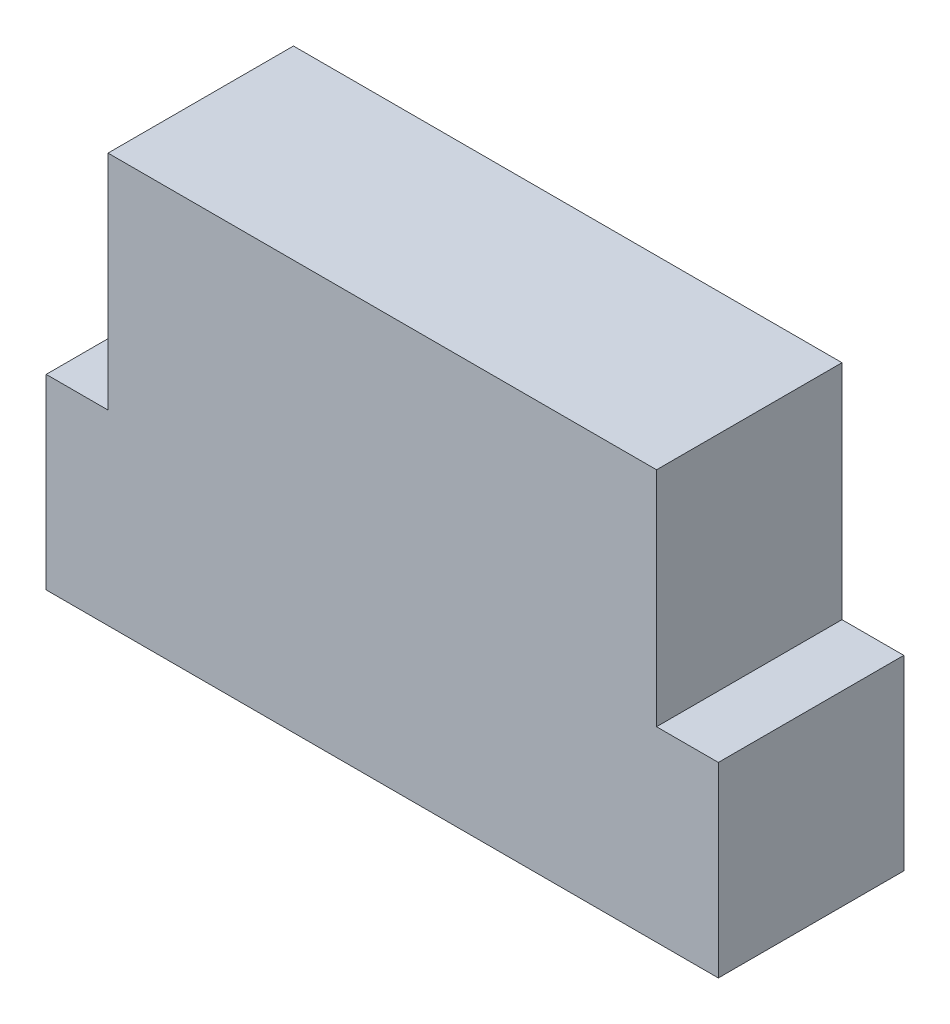
ISO-10303-21;
HEADER;
FILE_DESCRIPTION(('STEP AP214'),'2;1');
FILE_NAME('part.step','',(''),(''),'','','');
FILE_SCHEMA(('AUTOMOTIVE_DESIGN { 1 0 10303 214 1 1 1 1 }'));
ENDSEC;
DATA;
#1=APPLICATION_CONTEXT('core data for automotive mechanical design processes');
#2=APPLICATION_PROTOCOL_DEFINITION('international standard','automotive_design',2000,#1);
#3=PRODUCT_CONTEXT('',#1,'mechanical');
#4=PRODUCT('Part','Part','',(#3));
#5=PRODUCT_RELATED_PRODUCT_CATEGORY('part','',(#4));
#6=PRODUCT_DEFINITION_FORMATION('','',#4);
#7=PRODUCT_DEFINITION_CONTEXT('part definition',#1,'design');
#8=PRODUCT_DEFINITION('design','',#6,#7);
#9=PRODUCT_DEFINITION_SHAPE('','',#8);
#10=(LENGTH_UNIT() NAMED_UNIT(*) SI_UNIT(.MILLI.,.METRE.));
#11=(NAMED_UNIT(*) PLANE_ANGLE_UNIT() SI_UNIT($,.RADIAN.));
#12=(NAMED_UNIT(*) SI_UNIT($,.STERADIAN.) SOLID_ANGLE_UNIT());
#13=UNCERTAINTY_MEASURE_WITH_UNIT(LENGTH_MEASURE(1.E-05),#10,'distance_accuracy_value','');
#14=(GEOMETRIC_REPRESENTATION_CONTEXT(3) GLOBAL_UNCERTAINTY_ASSIGNED_CONTEXT((#13)) GLOBAL_UNIT_ASSIGNED_CONTEXT((#10,
#11,#12)) REPRESENTATION_CONTEXT('',''));
#15=CARTESIAN_POINT('',(0.,0.,0.));
#16=DIRECTION('',(0.,0.,1.));
#17=DIRECTION('',(1.,0.,0.));
#18=AXIS2_PLACEMENT_3D('',#15,#16,#17);
#19=CARTESIAN_POINT('',(26.0732989064762,1.79274179869862,6.06575945623128));
#20=DIRECTION('',(-1.,0.,0.));
#21=DIRECTION('',(0.,-1.,0.));
#22=AXIS2_PLACEMENT_3D('',#19,#20,#21);
#23=PLANE('',#22);
#24=DIRECTION('',(0.,0.,-1.));
#25=VECTOR('',#24,1.);
#26=CARTESIAN_POINT('',(26.0732989064762,0.292741798698615,7.46575945623128));
#27=LINE('',#26,#25);
#28=CARTESIAN_POINT('',(26.0732989064762,0.292741798698618,7.56575945623128));
#29=VERTEX_POINT('',#28);
#30=CARTESIAN_POINT('',(26.0732989064762,0.292741798698618,6.06575945623128));
#31=VERTEX_POINT('',#30);
#32=EDGE_CURVE('E324',#29,#31,#27,.T.);
#33=ORIENTED_EDGE('',*,*,#32,.T.);
#34=DIRECTION('',(0.,-1.,0.));
#35=VECTOR('',#34,1.);
#36=CARTESIAN_POINT('',(26.0732989064762,1.79274179869862,6.06575945623128));
#37=LINE('',#36,#35);
#38=CARTESIAN_POINT('',(26.0732989064762,2.09274179869862,6.06575945623128));
#39=VERTEX_POINT('',#38);
#40=EDGE_CURVE('E310',#39,#31,#37,.T.);
#41=ORIENTED_EDGE('',*,*,#40,.F.);
#42=DIRECTION('',(0.,0.,-1.));
#43=VECTOR('',#42,1.);
#44=CARTESIAN_POINT('',(26.0732989064762,2.09274179869862,7.46575945623128));
#45=LINE('',#44,#43);
#46=CARTESIAN_POINT('',(26.0732989064762,2.09274179869862,7.56575945623128));
#47=VERTEX_POINT('',#46);
#48=EDGE_CURVE('E285',#47,#39,#45,.T.);
#49=ORIENTED_EDGE('',*,*,#48,.F.);
#50=DIRECTION('',(0.,1.,0.));
#51=VECTOR('',#50,1.);
#52=CARTESIAN_POINT('',(26.0732989064762,0.292741798698618,7.56575945623128));
#53=LINE('',#52,#51);
#54=EDGE_CURVE('E230',#29,#47,#53,.T.);
#55=ORIENTED_EDGE('',*,*,#54,.F.);
#56=EDGE_LOOP('',(#33,#41,#49,#55));
#57=FACE_BOUND('',#56,.T.);
#58=ADVANCED_FACE('F42',(#57),#23,.F.);
#59=CARTESIAN_POINT('',(21.4694999999998,2.09274179869861,6.06575945623128));
#60=DIRECTION('',(0.,-1.,0.));
#61=DIRECTION('',(1.,0.,0.));
#62=AXIS2_PLACEMENT_3D('',#59,#60,#61);
#63=PLANE('',#62);
#64=DIRECTION('',(0.,0.,1.));
#65=VECTOR('',#64,1.);
#66=CARTESIAN_POINT('',(21.6367010935235,2.09274179869862,7.46575945623128));
#67=LINE('',#66,#65);
#68=CARTESIAN_POINT('',(21.6367010935235,2.09274179869862,6.06575945623128));
#69=VERTEX_POINT('',#68);
#70=CARTESIAN_POINT('',(21.6367010935235,2.09274179869862,7.56575945623128));
#71=VERTEX_POINT('',#70);
#72=EDGE_CURVE('E282',#69,#71,#67,.T.);
#73=ORIENTED_EDGE('',*,*,#72,.T.);
#74=DIRECTION('',(-1.,0.,0.));
#75=VECTOR('',#74,1.);
#76=CARTESIAN_POINT('',(26.0732989064762,2.09274179869862,7.56575945623128));
#77=LINE('',#76,#75);
#78=EDGE_CURVE('E234',#47,#71,#77,.T.);
#79=ORIENTED_EDGE('',*,*,#78,.F.);
#80=ORIENTED_EDGE('',*,*,#48,.T.);
#81=DIRECTION('',(-1.,0.,0.));
#82=VECTOR('',#81,1.);
#83=CARTESIAN_POINT('',(21.6367010935235,2.09274179869862,6.06575945623128));
#84=LINE('',#83,#82);
#85=EDGE_CURVE('E289',#39,#69,#84,.T.);
#86=ORIENTED_EDGE('',*,*,#85,.T.);
#87=EDGE_LOOP('',(#73,#79,#80,#86));
#88=FACE_BOUND('',#87,.T.);
#89=ADVANCED_FACE('F381',(#88),#63,.F.);
#90=CARTESIAN_POINT('',(21.6367010935235,1.79274179869862,7.46575945623128));
#91=DIRECTION('',(1.,0.,0.));
#92=DIRECTION('',(0.,1.,0.));
#93=AXIS2_PLACEMENT_3D('',#90,#91,#92);
#94=PLANE('',#93);
#95=DIRECTION('',(0.,0.,-1.));
#96=VECTOR('',#95,1.);
#97=CARTESIAN_POINT('',(21.6367010935235,0.292741798698615,7.46575945623128));
#98=LINE('',#97,#96);
#99=CARTESIAN_POINT('',(21.6367010935235,0.292741798698615,7.56575945623128));
#100=VERTEX_POINT('',#99);
#101=CARTESIAN_POINT('',(21.6367010935235,0.292741798698615,6.06575945623128));
#102=VERTEX_POINT('',#101);
#103=EDGE_CURVE('E332',#100,#102,#98,.T.);
#104=ORIENTED_EDGE('',*,*,#103,.F.);
#105=DIRECTION('',(0.,-1.,0.));
#106=VECTOR('',#105,1.);
#107=CARTESIAN_POINT('',(21.6367010935235,2.09274179869862,7.56575945623128));
#108=LINE('',#107,#106);
#109=EDGE_CURVE('E178',#71,#100,#108,.T.);
#110=ORIENTED_EDGE('',*,*,#109,.F.);
#111=ORIENTED_EDGE('',*,*,#72,.F.);
#112=DIRECTION('',(0.,-1.,0.));
#113=VECTOR('',#112,1.);
#114=CARTESIAN_POINT('',(21.6367010935235,1.79274179869862,6.06575945623128));
#115=LINE('',#114,#113);
#116=EDGE_CURVE('E307',#69,#102,#115,.T.);
#117=ORIENTED_EDGE('',*,*,#116,.T.);
#118=EDGE_LOOP('',(#104,#110,#111,#117));
#119=FACE_BOUND('',#118,.T.);
#120=ADVANCED_FACE('F384',(#119),#94,.F.);
#121=CARTESIAN_POINT('',(21.4694999999998,0.582342587762689,7.56575945623128));
#122=DIRECTION('',(0.,0.,1.));
#123=DIRECTION('',(1.,0.,0.));
#124=AXIS2_PLACEMENT_3D('',#121,#122,#123);
#125=PLANE('',#124);
#126=DIRECTION('',(0.,1.,0.));
#127=VECTOR('',#126,1.);
#128=CARTESIAN_POINT('',(21.1367010935235,0.292741798698615,7.56575945623128));
#129=LINE('',#128,#127);
#130=CARTESIAN_POINT('',(21.1367010935235,-1.21725820130139,7.56575945623128));
#131=VERTEX_POINT('',#130);
#132=CARTESIAN_POINT('',(21.1367010935235,0.292741798698615,7.56575945623128));
#133=VERTEX_POINT('',#132);
#134=EDGE_CURVE('E173',#131,#133,#129,.T.);
#135=ORIENTED_EDGE('',*,*,#134,.F.);
#136=DIRECTION('',(1.,0.,0.));
#137=VECTOR('',#136,1.);
#138=CARTESIAN_POINT('',(22.5084999999998,-1.21725820130138,7.56575945623128));
#139=LINE('',#138,#137);
#140=CARTESIAN_POINT('',(26.5732989064762,-1.21725820130138,7.56575945623128));
#141=VERTEX_POINT('',#140);
#142=EDGE_CURVE('E166',#131,#141,#139,.T.);
#143=ORIENTED_EDGE('',*,*,#142,.T.);
#144=DIRECTION('',(0.,-1.,0.));
#145=VECTOR('',#144,1.);
#146=CARTESIAN_POINT('',(26.5732989064762,0.292741798698619,7.56575945623128));
#147=LINE('',#146,#145);
#148=CARTESIAN_POINT('',(26.5732989064762,0.292741798698619,7.56575945623128));
#149=VERTEX_POINT('',#148);
#150=EDGE_CURVE('E171',#149,#141,#147,.T.);
#151=ORIENTED_EDGE('',*,*,#150,.F.);
#152=DIRECTION('',(-1.,0.,0.));
#153=VECTOR('',#152,1.);
#154=CARTESIAN_POINT('',(26.5732989064762,0.292741798698619,7.56575945623128));
#155=LINE('',#154,#153);
#156=EDGE_CURVE('E198',#149,#29,#155,.T.);
#157=ORIENTED_EDGE('',*,*,#156,.T.);
#158=ORIENTED_EDGE('',*,*,#54,.T.);
#159=ORIENTED_EDGE('',*,*,#78,.T.);
#160=ORIENTED_EDGE('',*,*,#109,.T.);
#161=DIRECTION('',(1.,0.,0.));
#162=VECTOR('',#161,1.);
#163=CARTESIAN_POINT('',(21.1367010935235,0.292741798698615,7.56575945623128));
#164=LINE('',#163,#162);
#165=EDGE_CURVE('E220',#133,#100,#164,.T.);
#166=ORIENTED_EDGE('',*,*,#165,.F.);
#167=EDGE_LOOP('',(#135,#143,#151,#157,#158,#159,#160,#166));
#168=FACE_BOUND('',#167,.T.);
#169=ADVANCED_FACE('F168',(#168),#125,.T.);
#170=CARTESIAN_POINT('',(21.1367010935235,0.,0.));
#171=DIRECTION('',(-1.,0.,0.));
#172=DIRECTION('',(0.,0.,1.));
#173=AXIS2_PLACEMENT_3D('',#170,#171,#172);
#174=PLANE('',#173);
#175=DIRECTION('',(0.,-1.,0.));
#176=VECTOR('',#175,1.);
#177=CARTESIAN_POINT('',(21.1367010935235,0.292741798698615,6.06575945623128));
#178=LINE('',#177,#176);
#179=CARTESIAN_POINT('',(21.1367010935235,0.292741798698615,6.06575945623128));
#180=VERTEX_POINT('',#179);
#181=CARTESIAN_POINT('',(21.1367010935235,-1.21725820130139,6.06575945623128));
#182=VERTEX_POINT('',#181);
#183=EDGE_CURVE('E204',#180,#182,#178,.T.);
#184=ORIENTED_EDGE('',*,*,#183,.T.);
#185=DIRECTION('',(0.,0.,1.));
#186=VECTOR('',#185,1.);
#187=CARTESIAN_POINT('',(21.1367010935235,-1.21725820130139,6.06575945623128));
#188=LINE('',#187,#186);
#189=EDGE_CURVE('E208',#182,#131,#188,.T.);
#190=ORIENTED_EDGE('',*,*,#189,.T.);
#191=ORIENTED_EDGE('',*,*,#134,.T.);
#192=DIRECTION('',(0.,0.,-1.));
#193=VECTOR('',#192,1.);
#194=CARTESIAN_POINT('',(21.1367010935235,0.292741798698615,6.06575945623128));
#195=LINE('',#194,#193);
#196=EDGE_CURVE('E213',#133,#180,#195,.T.);
#197=ORIENTED_EDGE('',*,*,#196,.T.);
#198=EDGE_LOOP('',(#184,#190,#191,#197));
#199=FACE_BOUND('',#198,.T.);
#200=ADVANCED_FACE('F413',(#199),#174,.T.);
#201=CARTESIAN_POINT('',(26.5732989064762,0.,0.));
#202=DIRECTION('',(1.,0.,0.));
#203=DIRECTION('',(0.,0.,-1.));
#204=AXIS2_PLACEMENT_3D('',#201,#202,#203);
#205=PLANE('',#204);
#206=ORIENTED_EDGE('',*,*,#150,.T.);
#207=DIRECTION('',(0.,0.,-1.));
#208=VECTOR('',#207,1.);
#209=CARTESIAN_POINT('',(26.5732989064762,-1.21725820130138,7.56575945623128));
#210=LINE('',#209,#208);
#211=CARTESIAN_POINT('',(26.5732989064762,-1.21725820130138,6.06575945623128));
#212=VERTEX_POINT('',#211);
#213=EDGE_CURVE('E181',#141,#212,#210,.T.);
#214=ORIENTED_EDGE('',*,*,#213,.T.);
#215=DIRECTION('',(0.,1.,0.));
#216=VECTOR('',#215,1.);
#217=CARTESIAN_POINT('',(26.5732989064762,0.292741798698619,6.06575945623128));
#218=LINE('',#217,#216);
#219=CARTESIAN_POINT('',(26.5732989064762,0.292741798698619,6.06575945623128));
#220=VERTEX_POINT('',#219);
#221=EDGE_CURVE('E185',#212,#220,#218,.T.);
#222=ORIENTED_EDGE('',*,*,#221,.T.);
#223=DIRECTION('',(0.,0.,1.));
#224=VECTOR('',#223,1.);
#225=CARTESIAN_POINT('',(26.5732989064762,0.292741798698619,7.56575945623128));
#226=LINE('',#225,#224);
#227=EDGE_CURVE('E189',#220,#149,#226,.T.);
#228=ORIENTED_EDGE('',*,*,#227,.T.);
#229=EDGE_LOOP('',(#206,#214,#222,#228));
#230=FACE_BOUND('',#229,.T.);
#231=ADVANCED_FACE('F187',(#230),#205,.T.);
#232=CARTESIAN_POINT('',(26.5732989064762,0.292741798698619,7.56575945623128));
#233=DIRECTION('',(0.,-1.,0.));
#234=DIRECTION('',(1.,0.,0.));
#235=AXIS2_PLACEMENT_3D('',#232,#233,#234);
#236=PLANE('',#235);
#237=DIRECTION('',(-1.,0.,0.));
#238=VECTOR('',#237,1.);
#239=CARTESIAN_POINT('',(26.5732989064762,0.292741798698619,6.06575945623128));
#240=LINE('',#239,#238);
#241=EDGE_CURVE('E201',#220,#31,#240,.T.);
#242=ORIENTED_EDGE('',*,*,#241,.T.);
#243=ORIENTED_EDGE('',*,*,#32,.F.);
#244=ORIENTED_EDGE('',*,*,#156,.F.);
#245=ORIENTED_EDGE('',*,*,#227,.F.);
#246=EDGE_LOOP('',(#242,#243,#244,#245));
#247=FACE_BOUND('',#246,.T.);
#248=ADVANCED_FACE('F399',(#247),#236,.F.);
#249=CARTESIAN_POINT('',(21.4694999999998,0.582342587762689,6.06575945623128));
#250=DIRECTION('',(0.,0.,-1.));
#251=DIRECTION('',(-1.,0.,0.));
#252=AXIS2_PLACEMENT_3D('',#249,#250,#251);
#253=PLANE('',#252);
#254=DIRECTION('',(1.,0.,0.));
#255=VECTOR('',#254,1.);
#256=CARTESIAN_POINT('',(25.2014999999999,-1.21725820130138,6.06575945623128));
#257=LINE('',#256,#255);
#258=EDGE_CURVE('E11',#182,#212,#257,.T.);
#259=ORIENTED_EDGE('',*,*,#258,.F.);
#260=ORIENTED_EDGE('',*,*,#183,.F.);
#261=DIRECTION('',(1.,0.,0.));
#262=VECTOR('',#261,1.);
#263=CARTESIAN_POINT('',(21.1367010935235,0.292741798698615,6.06575945623128));
#264=LINE('',#263,#262);
#265=EDGE_CURVE('E216',#180,#102,#264,.T.);
#266=ORIENTED_EDGE('',*,*,#265,.T.);
#267=ORIENTED_EDGE('',*,*,#116,.F.);
#268=ORIENTED_EDGE('',*,*,#85,.F.);
#269=ORIENTED_EDGE('',*,*,#40,.T.);
#270=ORIENTED_EDGE('',*,*,#241,.F.);
#271=ORIENTED_EDGE('',*,*,#221,.F.);
#272=EDGE_LOOP('',(#259,#260,#266,#267,#268,#269,#270,#271));
#273=FACE_BOUND('',#272,.T.);
#274=ADVANCED_FACE('F396',(#273),#253,.T.);
#275=CARTESIAN_POINT('',(21.1367010935235,0.292741798698615,6.06575945623128));
#276=DIRECTION('',(0.,-1.,0.));
#277=DIRECTION('',(1.,0.,0.));
#278=AXIS2_PLACEMENT_3D('',#275,#276,#277);
#279=PLANE('',#278);
#280=ORIENTED_EDGE('',*,*,#165,.T.);
#281=ORIENTED_EDGE('',*,*,#103,.T.);
#282=ORIENTED_EDGE('',*,*,#265,.F.);
#283=ORIENTED_EDGE('',*,*,#196,.F.);
#284=EDGE_LOOP('',(#280,#281,#282,#283));
#285=FACE_BOUND('',#284,.T.);
#286=ADVANCED_FACE('F398',(#285),#279,.F.);
#287=CARTESIAN_POINT('',(25.2014999999999,-1.21725820130138,6.26575945623128));
#288=DIRECTION('',(0.,1.,0.));
#289=DIRECTION('',(-1.,0.,0.));
#290=AXIS2_PLACEMENT_3D('',#287,#288,#289);
#291=PLANE('',#290);
#292=ORIENTED_EDGE('',*,*,#258,.T.);
#293=ORIENTED_EDGE('',*,*,#213,.F.);
#294=ORIENTED_EDGE('',*,*,#142,.F.);
#295=ORIENTED_EDGE('',*,*,#189,.F.);
#296=EDGE_LOOP('',(#292,#293,#294,#295));
#297=FACE_BOUND('',#296,.T.);
#298=ADVANCED_FACE('F44',(#297),#291,.F.);
#299=CLOSED_SHELL('',(#58,#89,#120,#169,#200,#231,#248,#274,#286,#298));
#300=CARTESIAN_POINT('',(21.4694999999998,0.582342587762689,6.26575945623128));
#301=DIRECTION('',(0.,0.,-1.));
#302=DIRECTION('',(-1.,0.,0.));
#303=AXIS2_PLACEMENT_3D('',#300,#301,#302);
#304=PLANE('',#303);
#305=DIRECTION('',(-1.,0.,0.));
#306=VECTOR('',#305,1.);
#307=CARTESIAN_POINT('',(21.4694999999998,0.292741798698615,6.26575945623128));
#308=LINE('',#307,#306);
#309=CARTESIAN_POINT('',(25.73834591186,0.292741798698618,6.26575945623128));
#310=VERTEX_POINT('',#309);
#311=CARTESIAN_POINT('',(21.9716540881397,0.292741798698616,6.26575945623128));
#312=VERTEX_POINT('',#311);
#313=EDGE_CURVE('E226',#310,#312,#308,.T.);
#314=ORIENTED_EDGE('',*,*,#313,.F.);
#315=DIRECTION('',(0.,-1.,0.));
#316=VECTOR('',#315,1.);
#317=CARTESIAN_POINT('',(25.73834591186,1.79274179869862,6.26575945623128));
#318=LINE('',#317,#316);
#319=CARTESIAN_POINT('',(25.73834591186,1.79274179869862,6.26575945623128));
#320=VERTEX_POINT('',#319);
#321=EDGE_CURVE('E317',#320,#310,#318,.T.);
#322=ORIENTED_EDGE('',*,*,#321,.F.);
#323=DIRECTION('',(1.,0.,0.));
#324=VECTOR('',#323,1.);
#325=CARTESIAN_POINT('',(25.73834591186,1.79274179869862,6.26575945623128));
#326=LINE('',#325,#324);
#327=CARTESIAN_POINT('',(21.9716540881397,1.79274179869862,6.26575945623128));
#328=VERTEX_POINT('',#327);
#329=EDGE_CURVE('E93',#328,#320,#326,.T.);
#330=ORIENTED_EDGE('',*,*,#329,.F.);
#331=DIRECTION('',(0.,-1.,0.));
#332=VECTOR('',#331,1.);
#333=CARTESIAN_POINT('',(21.9716540881397,1.79274179869862,6.26575945623128));
#334=LINE('',#333,#332);
#335=EDGE_CURVE('E321',#328,#312,#334,.T.);
#336=ORIENTED_EDGE('',*,*,#335,.T.);
#337=EDGE_LOOP('',(#314,#322,#330,#336));
#338=FACE_BOUND('',#337,.T.);
#339=ADVANCED_FACE('F342',(#338),#304,.F.);
#340=CARTESIAN_POINT('',(21.4694999999998,0.582342587762689,7.46575945623128));
#341=DIRECTION('',(0.,0.,1.));
#342=DIRECTION('',(1.,0.,0.));
#343=AXIS2_PLACEMENT_3D('',#340,#341,#342);
#344=PLANE('',#343);
#345=DIRECTION('',(0.,-1.,0.));
#346=VECTOR('',#345,1.);
#347=CARTESIAN_POINT('',(25.73834591186,1.79274179869862,7.46575945623128));
#348=LINE('',#347,#346);
#349=CARTESIAN_POINT('',(25.73834591186,1.79274179869862,7.46575945623128));
#350=VERTEX_POINT('',#349);
#351=CARTESIAN_POINT('',(25.73834591186,0.292741798698618,7.46575945623128));
#352=VERTEX_POINT('',#351);
#353=EDGE_CURVE('E314',#350,#352,#348,.T.);
#354=ORIENTED_EDGE('',*,*,#353,.T.);
#355=DIRECTION('',(1.,0.,0.));
#356=VECTOR('',#355,1.);
#357=CARTESIAN_POINT('',(21.4694999999998,0.292741798698615,7.46575945623128));
#358=LINE('',#357,#356);
#359=CARTESIAN_POINT('',(21.9716540881397,0.292741798698616,7.46575945623128));
#360=VERTEX_POINT('',#359);
#361=EDGE_CURVE('E89',#360,#352,#358,.T.);
#362=ORIENTED_EDGE('',*,*,#361,.F.);
#363=DIRECTION('',(0.,-1.,0.));
#364=VECTOR('',#363,1.);
#365=CARTESIAN_POINT('',(21.9716540881397,1.79274179869862,7.46575945623128));
#366=LINE('',#365,#364);
#367=CARTESIAN_POINT('',(21.9716540881397,1.79274179869862,7.46575945623128));
#368=VERTEX_POINT('',#367);
#369=EDGE_CURVE('E304',#368,#360,#366,.T.);
#370=ORIENTED_EDGE('',*,*,#369,.F.);
#371=DIRECTION('',(1.,0.,0.));
#372=VECTOR('',#371,1.);
#373=CARTESIAN_POINT('',(21.6367010935235,1.79274179869862,7.46575945623128));
#374=LINE('',#373,#372);
#375=EDGE_CURVE('E273',#368,#350,#374,.T.);
#376=ORIENTED_EDGE('',*,*,#375,.T.);
#377=EDGE_LOOP('',(#354,#362,#370,#376));
#378=FACE_BOUND('',#377,.T.);
#379=ADVANCED_FACE('F348',(#378),#344,.F.);
#380=CARTESIAN_POINT('',(21.9716540881397,1.79274179869862,6.26575945623128));
#381=DIRECTION('',(-1.,0.,0.));
#382=DIRECTION('',(0.,-1.,0.));
#383=AXIS2_PLACEMENT_3D('',#380,#381,#382);
#384=PLANE('',#383);
#385=DIRECTION('',(0.,0.,-1.));
#386=VECTOR('',#385,1.);
#387=CARTESIAN_POINT('',(21.9716540881397,0.292741798698615,7.46575945623128));
#388=LINE('',#387,#386);
#389=EDGE_CURVE('E52',#360,#312,#388,.T.);
#390=ORIENTED_EDGE('',*,*,#389,.T.);
#391=ORIENTED_EDGE('',*,*,#335,.F.);
#392=DIRECTION('',(0.,0.,-1.));
#393=VECTOR('',#392,1.);
#394=CARTESIAN_POINT('',(21.9716540881397,1.79274179869862,6.26575945623128));
#395=LINE('',#394,#393);
#396=EDGE_CURVE('E68',#368,#328,#395,.T.);
#397=ORIENTED_EDGE('',*,*,#396,.F.);
#398=ORIENTED_EDGE('',*,*,#369,.T.);
#399=EDGE_LOOP('',(#390,#391,#397,#398));
#400=FACE_BOUND('',#399,.T.);
#401=ADVANCED_FACE('F338',(#400),#384,.F.);
#402=CARTESIAN_POINT('',(25.73834591186,1.79274179869862,7.46575945623128));
#403=DIRECTION('',(1.,0.,0.));
#404=DIRECTION('',(0.,1.,0.));
#405=AXIS2_PLACEMENT_3D('',#402,#403,#404);
#406=PLANE('',#405);
#407=DIRECTION('',(0.,0.,-1.));
#408=VECTOR('',#407,1.);
#409=CARTESIAN_POINT('',(25.73834591186,0.292741798698615,7.46575945623128));
#410=LINE('',#409,#408);
#411=EDGE_CURVE('E328',#352,#310,#410,.T.);
#412=ORIENTED_EDGE('',*,*,#411,.F.);
#413=ORIENTED_EDGE('',*,*,#353,.F.);
#414=DIRECTION('',(0.,0.,1.));
#415=VECTOR('',#414,1.);
#416=CARTESIAN_POINT('',(25.73834591186,1.79274179869862,7.46575945623128));
#417=LINE('',#416,#415);
#418=EDGE_CURVE('E300',#320,#350,#417,.T.);
#419=ORIENTED_EDGE('',*,*,#418,.F.);
#420=ORIENTED_EDGE('',*,*,#321,.T.);
#421=EDGE_LOOP('',(#412,#413,#419,#420));
#422=FACE_BOUND('',#421,.T.);
#423=ADVANCED_FACE('F345',(#422),#406,.F.);
#424=CARTESIAN_POINT('',(21.4694999999998,1.79274179869862,6.06575945623128));
#425=DIRECTION('',(0.,-1.,0.));
#426=DIRECTION('',(1.,0.,0.));
#427=AXIS2_PLACEMENT_3D('',#424,#425,#426);
#428=PLANE('',#427);
#429=DIRECTION('',(1.,0.,0.));
#430=VECTOR('',#429,1.);
#431=CARTESIAN_POINT('',(21.4694999999998,1.79274179869862,6.36575945623128));
#432=LINE('',#431,#430);
#433=CARTESIAN_POINT('',(21.9889999999999,1.79274179869862,6.36575945623128));
#434=VERTEX_POINT('',#433);
#435=CARTESIAN_POINT('',(25.7209999999999,1.79274179869862,6.36575945623128));
#436=VERTEX_POINT('',#435);
#437=EDGE_CURVE('E59',#434,#436,#432,.T.);
#438=ORIENTED_EDGE('',*,*,#437,.F.);
#439=DIRECTION('',(0.,0.,-1.));
#440=VECTOR('',#439,1.);
#441=CARTESIAN_POINT('',(21.9889999999999,1.79274179869862,6.06575945623128));
#442=LINE('',#441,#440);
#443=CARTESIAN_POINT('',(21.9889999999999,1.79274179869862,7.36575945623128));
#444=VERTEX_POINT('',#443);
#445=EDGE_CURVE('E246',#444,#434,#442,.T.);
#446=ORIENTED_EDGE('',*,*,#445,.F.);
#447=DIRECTION('',(1.,0.,0.));
#448=VECTOR('',#447,1.);
#449=CARTESIAN_POINT('',(21.4694999999998,1.79274179869862,7.36575945623128));
#450=LINE('',#449,#448);
#451=CARTESIAN_POINT('',(25.7209999999999,1.79274179869862,7.36575945623128));
#452=VERTEX_POINT('',#451);
#453=EDGE_CURVE('E263',#444,#452,#450,.T.);
#454=ORIENTED_EDGE('',*,*,#453,.T.);
#455=DIRECTION('',(0.,0.,-1.));
#456=VECTOR('',#455,1.);
#457=CARTESIAN_POINT('',(25.7209999999999,1.79274179869862,6.06575945623128));
#458=LINE('',#457,#456);
#459=EDGE_CURVE('E259',#452,#436,#458,.T.);
#460=ORIENTED_EDGE('',*,*,#459,.T.);
#461=EDGE_LOOP('',(#438,#446,#454,#460));
#462=FACE_BOUND('',#461,.T.);
#463=ORIENTED_EDGE('',*,*,#375,.F.);
#464=ORIENTED_EDGE('',*,*,#396,.T.);
#465=ORIENTED_EDGE('',*,*,#329,.T.);
#466=ORIENTED_EDGE('',*,*,#418,.T.);
#467=EDGE_LOOP('',(#463,#464,#465,#466));
#468=FACE_BOUND('',#467,.T.);
#469=ADVANCED_FACE('F347',(#462,#468),#428,.T.);
#470=CARTESIAN_POINT('',(21.4694999999998,1.89274179869862,6.36575945623128));
#471=DIRECTION('',(0.,0.,-1.));
#472=DIRECTION('',(-1.,0.,0.));
#473=AXIS2_PLACEMENT_3D('',#470,#471,#472);
#474=PLANE('',#473);
#475=ORIENTED_EDGE('',*,*,#437,.T.);
#476=DIRECTION('',(0.,-1.,0.));
#477=VECTOR('',#476,1.);
#478=CARTESIAN_POINT('',(25.7209999999999,1.89274179869862,6.36575945623128));
#479=LINE('',#478,#477);
#480=CARTESIAN_POINT('',(25.7209999999999,1.89274179869862,6.36575945623128));
#481=VERTEX_POINT('',#480);
#482=EDGE_CURVE('E256',#481,#436,#479,.T.);
#483=ORIENTED_EDGE('',*,*,#482,.F.);
#484=DIRECTION('',(1.,0.,0.));
#485=VECTOR('',#484,1.);
#486=CARTESIAN_POINT('',(21.4694999999998,1.89274179869862,6.36575945623128));
#487=LINE('',#486,#485);
#488=CARTESIAN_POINT('',(21.9889999999999,1.89274179869862,6.36575945623128));
#489=VERTEX_POINT('',#488);
#490=EDGE_CURVE('E241',#489,#481,#487,.T.);
#491=ORIENTED_EDGE('',*,*,#490,.F.);
#492=DIRECTION('',(0.,-1.,0.));
#493=VECTOR('',#492,1.);
#494=CARTESIAN_POINT('',(21.9889999999999,1.89274179869862,6.36575945623128));
#495=LINE('',#494,#493);
#496=EDGE_CURVE('E270',#489,#434,#495,.T.);
#497=ORIENTED_EDGE('',*,*,#496,.T.);
#498=EDGE_LOOP('',(#475,#483,#491,#497));
#499=FACE_BOUND('',#498,.T.);
#500=ADVANCED_FACE('F371',(#499),#474,.F.);
#501=CARTESIAN_POINT('',(21.9889999999999,1.89274179869862,6.06575945623128));
#502=DIRECTION('',(-1.,0.,0.));
#503=DIRECTION('',(0.,-1.,0.));
#504=AXIS2_PLACEMENT_3D('',#501,#502,#503);
#505=PLANE('',#504);
#506=ORIENTED_EDGE('',*,*,#445,.T.);
#507=ORIENTED_EDGE('',*,*,#496,.F.);
#508=DIRECTION('',(0.,0.,-1.));
#509=VECTOR('',#508,1.);
#510=CARTESIAN_POINT('',(21.9889999999999,1.89274179869862,6.06575945623128));
#511=LINE('',#510,#509);
#512=CARTESIAN_POINT('',(21.9889999999999,1.89274179869862,7.36575945623128));
#513=VERTEX_POINT('',#512);
#514=EDGE_CURVE('E252',#513,#489,#511,.T.);
#515=ORIENTED_EDGE('',*,*,#514,.F.);
#516=DIRECTION('',(0.,-1.,0.));
#517=VECTOR('',#516,1.);
#518=CARTESIAN_POINT('',(21.9889999999999,1.89274179869862,7.36575945623128));
#519=LINE('',#518,#517);
#520=EDGE_CURVE('E274',#513,#444,#519,.T.);
#521=ORIENTED_EDGE('',*,*,#520,.T.);
#522=EDGE_LOOP('',(#506,#507,#515,#521));
#523=FACE_BOUND('',#522,.T.);
#524=ADVANCED_FACE('F367',(#523),#505,.F.);
#525=CARTESIAN_POINT('',(21.4694999999998,1.89274179869862,7.36575945623128));
#526=DIRECTION('',(0.,0.,-1.));
#527=DIRECTION('',(-1.,0.,0.));
#528=AXIS2_PLACEMENT_3D('',#525,#526,#527);
#529=PLANE('',#528);
#530=ORIENTED_EDGE('',*,*,#453,.F.);
#531=ORIENTED_EDGE('',*,*,#520,.F.);
#532=DIRECTION('',(1.,0.,0.));
#533=VECTOR('',#532,1.);
#534=CARTESIAN_POINT('',(21.4694999999998,1.89274179869862,7.36575945623128));
#535=LINE('',#534,#533);
#536=CARTESIAN_POINT('',(25.7209999999999,1.89274179869862,7.36575945623128));
#537=VERTEX_POINT('',#536);
#538=EDGE_CURVE('E249',#513,#537,#535,.T.);
#539=ORIENTED_EDGE('',*,*,#538,.T.);
#540=DIRECTION('',(0.,-1.,0.));
#541=VECTOR('',#540,1.);
#542=CARTESIAN_POINT('',(25.7209999999999,1.89274179869862,7.36575945623128));
#543=LINE('',#542,#541);
#544=EDGE_CURVE('E277',#537,#452,#543,.T.);
#545=ORIENTED_EDGE('',*,*,#544,.T.);
#546=EDGE_LOOP('',(#530,#531,#539,#545));
#547=FACE_BOUND('',#546,.T.);
#548=ADVANCED_FACE('F370',(#547),#529,.T.);
#549=CARTESIAN_POINT('',(25.7209999999999,1.89274179869862,6.06575945623128));
#550=DIRECTION('',(-1.,0.,0.));
#551=DIRECTION('',(0.,0.,1.));
#552=AXIS2_PLACEMENT_3D('',#549,#550,#551);
#553=PLANE('',#552);
#554=ORIENTED_EDGE('',*,*,#459,.F.);
#555=ORIENTED_EDGE('',*,*,#544,.F.);
#556=DIRECTION('',(0.,0.,-1.));
#557=VECTOR('',#556,1.);
#558=CARTESIAN_POINT('',(25.7209999999999,1.89274179869862,6.06575945623128));
#559=LINE('',#558,#557);
#560=EDGE_CURVE('E245',#537,#481,#559,.T.);
#561=ORIENTED_EDGE('',*,*,#560,.T.);
#562=ORIENTED_EDGE('',*,*,#482,.T.);
#563=EDGE_LOOP('',(#554,#555,#561,#562));
#564=FACE_BOUND('',#563,.T.);
#565=ADVANCED_FACE('F365',(#564),#553,.T.);
#566=CARTESIAN_POINT('',(21.4694999999998,1.89274179869862,6.06575945623128));
#567=DIRECTION('',(0.,-1.,0.));
#568=DIRECTION('',(1.,0.,0.));
#569=AXIS2_PLACEMENT_3D('',#566,#567,#568);
#570=PLANE('',#569);
#571=ORIENTED_EDGE('',*,*,#490,.T.);
#572=ORIENTED_EDGE('',*,*,#560,.F.);
#573=ORIENTED_EDGE('',*,*,#538,.F.);
#574=ORIENTED_EDGE('',*,*,#514,.T.);
#575=EDGE_LOOP('',(#571,#572,#573,#574));
#576=FACE_BOUND('',#575,.T.);
#577=ADVANCED_FACE('F362',(#576),#570,.T.);
#578=ORIENTED_EDGE('',*,*,#361,.T.);
#579=ORIENTED_EDGE('',*,*,#411,.T.);
#580=ORIENTED_EDGE('',*,*,#313,.T.);
#581=ORIENTED_EDGE('',*,*,#389,.F.);
#582=EDGE_LOOP('',(#578,#579,#580,#581));
#583=FACE_BOUND('',#582,.T.);
#584=ADVANCED_FACE('F340',(#583),#279,.F.);
#585=CLOSED_SHELL('',(#339,#379,#401,#423,#469,#500,#524,#548,#565,#577,#584));
#586=ORIENTED_CLOSED_SHELL('',*,#585,.T.);
#587=BREP_WITH_VOIDS('B2',#299,(#586));
#588=ADVANCED_BREP_SHAPE_REPRESENTATION('',(#18,#587),#14);
#589=SHAPE_DEFINITION_REPRESENTATION(#9,#588);
ENDSEC;
END-ISO-10303-21;
